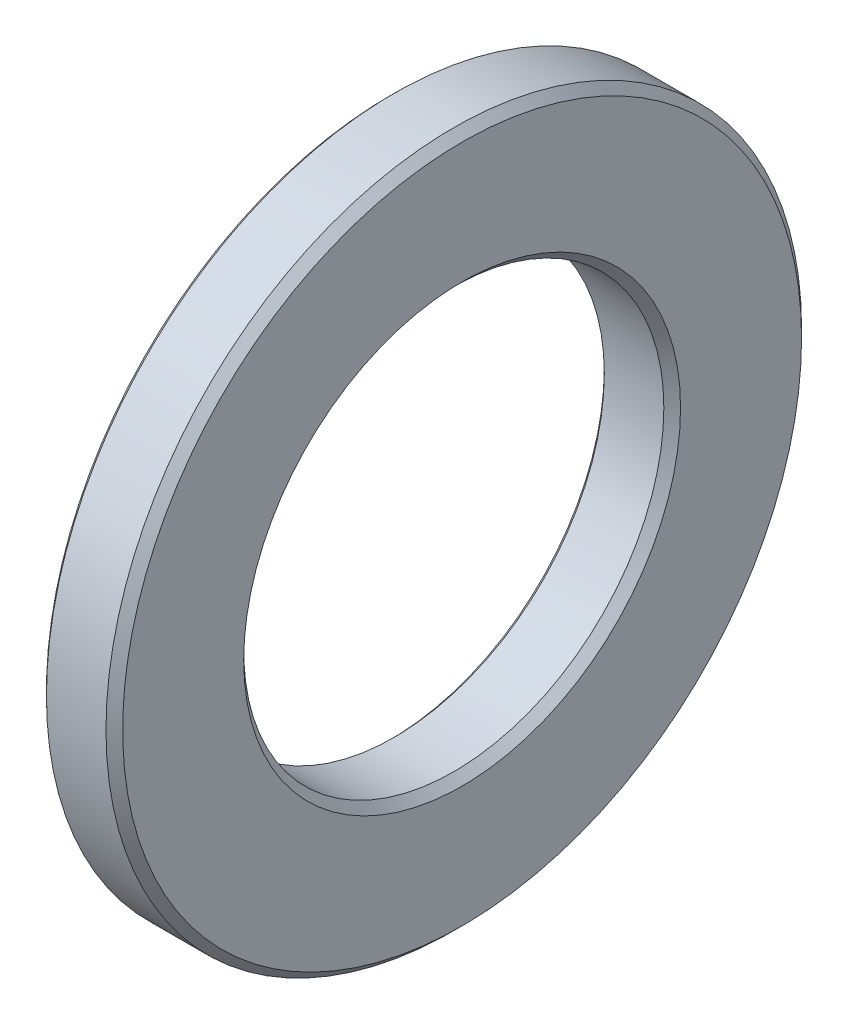
ISO-10303-21;
HEADER;
FILE_DESCRIPTION(('STEP AP214'),'2;1');
FILE_NAME('part.step','',(''),(''),'','','');
FILE_SCHEMA(('AUTOMOTIVE_DESIGN { 1 0 10303 214 1 1 1 1 }'));
ENDSEC;
DATA;
#1=APPLICATION_CONTEXT('core data for automotive mechanical design processes');
#2=APPLICATION_PROTOCOL_DEFINITION('international standard','automotive_design',2000,#1);
#3=PRODUCT_CONTEXT('',#1,'mechanical');
#4=PRODUCT('Part','Part','',(#3));
#5=PRODUCT_RELATED_PRODUCT_CATEGORY('part','',(#4));
#6=PRODUCT_DEFINITION_FORMATION('','',#4);
#7=PRODUCT_DEFINITION_CONTEXT('part definition',#1,'design');
#8=PRODUCT_DEFINITION('design','',#6,#7);
#9=PRODUCT_DEFINITION_SHAPE('','',#8);
#10=(LENGTH_UNIT() NAMED_UNIT(*) SI_UNIT(.MILLI.,.METRE.));
#11=(NAMED_UNIT(*) PLANE_ANGLE_UNIT() SI_UNIT($,.RADIAN.));
#12=(NAMED_UNIT(*) SI_UNIT($,.STERADIAN.) SOLID_ANGLE_UNIT());
#13=UNCERTAINTY_MEASURE_WITH_UNIT(LENGTH_MEASURE(1.E-05),#10,'distance_accuracy_value','');
#14=(GEOMETRIC_REPRESENTATION_CONTEXT(3) GLOBAL_UNCERTAINTY_ASSIGNED_CONTEXT((#13)) GLOBAL_UNIT_ASSIGNED_CONTEXT((#10,
#11,#12)) REPRESENTATION_CONTEXT('',''));
#15=CARTESIAN_POINT('',(0.,0.,0.));
#16=DIRECTION('',(0.,0.,1.));
#17=DIRECTION('',(1.,0.,0.));
#18=AXIS2_PLACEMENT_3D('',#15,#16,#17);
#19=CARTESIAN_POINT('',(14.,0.,20.05025));
#20=DIRECTION('',(1.,0.,0.));
#21=DIRECTION('',(0.,-1.,0.));
#22=AXIS2_PLACEMENT_3D('',#19,#20,#21);
#23=PLANE('',#22);
#24=CARTESIAN_POINT('',(14.,0.,0.));
#25=DIRECTION('',(-1.,0.,0.));
#26=DIRECTION('',(0.,0.,1.));
#27=AXIS2_PLACEMENT_3D('',#24,#25,#26);
#28=CIRCLE('',#27,15.7005);
#29=CARTESIAN_POINT('',(14.,0.,-15.7005));
#30=VERTEX_POINT('',#29);
#31=EDGE_CURVE('E98',#30,#30,#28,.T.);
#32=ORIENTED_EDGE('',*,*,#31,.T.);
#33=EDGE_LOOP('',(#32));
#34=FACE_BOUND('',#33,.T.);
#35=CARTESIAN_POINT('',(14.,0.,0.));
#36=DIRECTION('',(-1.,0.,0.));
#37=DIRECTION('',(0.,0.,1.));
#38=AXIS2_PLACEMENT_3D('',#35,#36,#37);
#39=CIRCLE('',#38,24.4);
#40=CARTESIAN_POINT('',(14.,0.,-24.4));
#41=VERTEX_POINT('',#40);
#42=EDGE_CURVE('E11',#41,#41,#39,.T.);
#43=ORIENTED_EDGE('',*,*,#42,.F.);
#44=EDGE_LOOP('',(#43));
#45=FACE_BOUND('',#44,.T.);
#46=ADVANCED_FACE('F17',(#34,#45),#23,.T.);
#47=CARTESIAN_POINT('',(8.82,0.,16.7788787393238));
#48=DIRECTION('',(-1.,0.,0.));
#49=DIRECTION('',(0.,1.,0.));
#50=AXIS2_PLACEMENT_3D('',#47,#48,#49);
#51=PLANE('',#50);
#52=CARTESIAN_POINT('',(8.82,0.,0.));
#53=DIRECTION('',(-1.,0.,0.));
#54=DIRECTION('',(0.,0.,1.));
#55=AXIS2_PLACEMENT_3D('',#52,#53,#54);
#56=CIRCLE('',#55,15.4005);
#57=CARTESIAN_POINT('',(8.82,0.,-15.4005));
#58=VERTEX_POINT('',#57);
#59=EDGE_CURVE('E85',#58,#58,#56,.T.);
#60=ORIENTED_EDGE('',*,*,#59,.F.);
#61=EDGE_LOOP('',(#60));
#62=FACE_BOUND('',#61,.T.);
#63=CARTESIAN_POINT('',(8.82,0.,0.));
#64=DIRECTION('',(-1.,0.,0.));
#65=DIRECTION('',(0.,0.,1.));
#66=AXIS2_PLACEMENT_3D('',#63,#64,#65);
#67=CIRCLE('',#66,18.1572574786477);
#68=CARTESIAN_POINT('',(8.82,0.,18.1572574786477));
#69=VERTEX_POINT('',#68);
#70=EDGE_CURVE('E81',#69,#69,#67,.T.);
#71=ORIENTED_EDGE('',*,*,#70,.T.);
#72=EDGE_LOOP('',(#71));
#73=FACE_BOUND('',#72,.T.);
#74=ADVANCED_FACE('F19',(#62,#73),#51,.T.);
#75=CARTESIAN_POINT('',(8.82,0.,23.2713712606762));
#76=DIRECTION('',(-1.,0.,0.));
#77=DIRECTION('',(0.,0.,1.));
#78=AXIS2_PLACEMENT_3D('',#75,#76,#77);
#79=PLANE('',#78);
#80=CARTESIAN_POINT('',(8.82,0.,0.));
#81=DIRECTION('',(-1.,0.,0.));
#82=DIRECTION('',(0.,0.,1.));
#83=AXIS2_PLACEMENT_3D('',#80,#81,#82);
#84=CIRCLE('',#83,21.8427425213523);
#85=CARTESIAN_POINT('',(8.82,-21.8427425213523,0.));
#86=VERTEX_POINT('',#85);
#87=EDGE_CURVE('E21',#86,#86,#84,.T.);
#88=ORIENTED_EDGE('',*,*,#87,.F.);
#89=EDGE_LOOP('',(#88));
#90=FACE_BOUND('',#89,.T.);
#91=CARTESIAN_POINT('',(8.82,0.,0.));
#92=DIRECTION('',(-1.,0.,0.));
#93=DIRECTION('',(0.,0.,1.));
#94=AXIS2_PLACEMENT_3D('',#91,#92,#93);
#95=CIRCLE('',#94,24.7);
#96=CARTESIAN_POINT('',(8.82,0.,-24.7));
#97=VERTEX_POINT('',#96);
#98=EDGE_CURVE('E70',#97,#97,#95,.T.);
#99=ORIENTED_EDGE('',*,*,#98,.T.);
#100=EDGE_LOOP('',(#99));
#101=FACE_BOUND('',#100,.T.);
#102=ADVANCED_FACE('F71',(#90,#101),#79,.T.);
#103=CARTESIAN_POINT('',(13.7,0.,0.));
#104=DIRECTION('',(-1.,0.,0.));
#105=DIRECTION('',(0.,0.,1.));
#106=AXIS2_PLACEMENT_3D('',#103,#104,#105);
#107=CONICAL_SURFACE('',#106,24.7,0.78539816339745);
#108=ORIENTED_EDGE('',*,*,#42,.T.);
#109=EDGE_LOOP('',(#108));
#110=FACE_BOUND('',#109,.T.);
#111=CARTESIAN_POINT('',(13.4,0.,0.));
#112=DIRECTION('',(-1.,0.,0.));
#113=DIRECTION('',(0.,0.,1.));
#114=AXIS2_PLACEMENT_3D('',#111,#112,#113);
#115=CIRCLE('',#114,25.);
#116=CARTESIAN_POINT('',(13.4,0.,-25.));
#117=VERTEX_POINT('',#116);
#118=EDGE_CURVE('E28',#117,#117,#115,.T.);
#119=ORIENTED_EDGE('',*,*,#118,.F.);
#120=EDGE_LOOP('',(#119));
#121=FACE_BOUND('',#120,.T.);
#122=ADVANCED_FACE('F138',(#110,#121),#107,.T.);
#123=CARTESIAN_POINT('',(11.26,0.,0.));
#124=DIRECTION('',(-1.,0.,0.));
#125=DIRECTION('',(0.,0.,1.));
#126=AXIS2_PLACEMENT_3D('',#123,#124,#125);
#127=CYLINDRICAL_SURFACE('',#126,25.);
#128=ORIENTED_EDGE('',*,*,#118,.T.);
#129=EDGE_LOOP('',(#128));
#130=FACE_BOUND('',#129,.T.);
#131=CARTESIAN_POINT('',(9.12,0.,0.));
#132=DIRECTION('',(-1.,0.,0.));
#133=DIRECTION('',(0.,0.,1.));
#134=AXIS2_PLACEMENT_3D('',#131,#132,#133);
#135=CIRCLE('',#134,25.);
#136=CARTESIAN_POINT('',(9.12,0.,-25.));
#137=VERTEX_POINT('',#136);
#138=EDGE_CURVE('E74',#137,#137,#135,.T.);
#139=ORIENTED_EDGE('',*,*,#138,.F.);
#140=EDGE_LOOP('',(#139));
#141=FACE_BOUND('',#140,.T.);
#142=ADVANCED_FACE('F136',(#130,#141),#127,.T.);
#143=CARTESIAN_POINT('',(8.97,0.,0.));
#144=DIRECTION('',(1.,0.,0.));
#145=DIRECTION('',(0.,0.,1.));
#146=AXIS2_PLACEMENT_3D('',#143,#144,#145);
#147=CONICAL_SURFACE('',#146,24.85,0.78539816339745);
#148=ORIENTED_EDGE('',*,*,#138,.T.);
#149=EDGE_LOOP('',(#148));
#150=FACE_BOUND('',#149,.T.);
#151=ORIENTED_EDGE('',*,*,#98,.F.);
#152=EDGE_LOOP('',(#151));
#153=FACE_BOUND('',#152,.T.);
#154=ADVANCED_FACE('F123',(#150,#153),#147,.T.);
#155=CARTESIAN_POINT('',(7.,0.,0.));
#156=DIRECTION('',(-1.,0.,0.));
#157=DIRECTION('',(0.,-1.,0.));
#158=AXIS2_PLACEMENT_3D('',#155,#156,#157);
#159=TOROIDAL_SURFACE('',#158,20.,2.59);
#160=ORIENTED_EDGE('',*,*,#87,.T.);
#161=EDGE_LOOP('',(#160));
#162=FACE_BOUND('',#161,.T.);
#163=ORIENTED_EDGE('',*,*,#70,.F.);
#164=EDGE_LOOP('',(#163));
#165=FACE_BOUND('',#164,.T.);
#166=ADVANCED_FACE('F118',(#162,#165),#159,.F.);
#167=CARTESIAN_POINT('',(8.97,0.,0.));
#168=DIRECTION('',(-1.,0.,0.));
#169=DIRECTION('',(0.,0.,1.));
#170=AXIS2_PLACEMENT_3D('',#167,#168,#169);
#171=CONICAL_SURFACE('',#170,15.2505,0.78539816339745);
#172=CARTESIAN_POINT('',(9.12,0.,0.));
#173=DIRECTION('',(-1.,0.,0.));
#174=DIRECTION('',(0.,0.,1.));
#175=AXIS2_PLACEMENT_3D('',#172,#173,#174);
#176=CIRCLE('',#175,15.1005);
#177=CARTESIAN_POINT('',(9.12,0.,-15.1005));
#178=VERTEX_POINT('',#177);
#179=EDGE_CURVE('E91',#178,#178,#176,.T.);
#180=ORIENTED_EDGE('',*,*,#179,.F.);
#181=EDGE_LOOP('',(#180));
#182=FACE_BOUND('',#181,.T.);
#183=ORIENTED_EDGE('',*,*,#59,.T.);
#184=EDGE_LOOP('',(#183));
#185=FACE_BOUND('',#184,.T.);
#186=ADVANCED_FACE('F113',(#182,#185),#171,.F.);
#187=CARTESIAN_POINT('',(11.26,0.,0.));
#188=DIRECTION('',(-1.,0.,0.));
#189=DIRECTION('',(0.,0.,1.));
#190=AXIS2_PLACEMENT_3D('',#187,#188,#189);
#191=CYLINDRICAL_SURFACE('',#190,15.1005);
#192=CARTESIAN_POINT('',(13.4,0.,0.));
#193=DIRECTION('',(-1.,0.,0.));
#194=DIRECTION('',(0.,0.,1.));
#195=AXIS2_PLACEMENT_3D('',#192,#193,#194);
#196=CIRCLE('',#195,15.1005);
#197=CARTESIAN_POINT('',(13.4,0.,-15.1005));
#198=VERTEX_POINT('',#197);
#199=EDGE_CURVE('E102',#198,#198,#196,.T.);
#200=ORIENTED_EDGE('',*,*,#199,.F.);
#201=EDGE_LOOP('',(#200));
#202=FACE_BOUND('',#201,.T.);
#203=ORIENTED_EDGE('',*,*,#179,.T.);
#204=EDGE_LOOP('',(#203));
#205=FACE_BOUND('',#204,.T.);
#206=ADVANCED_FACE('F110',(#202,#205),#191,.F.);
#207=CARTESIAN_POINT('',(13.7,0.,0.));
#208=DIRECTION('',(1.,0.,0.));
#209=DIRECTION('',(0.,0.,1.));
#210=AXIS2_PLACEMENT_3D('',#207,#208,#209);
#211=CONICAL_SURFACE('',#210,15.4005,0.78539816339745);
#212=ORIENTED_EDGE('',*,*,#31,.F.);
#213=EDGE_LOOP('',(#212));
#214=FACE_BOUND('',#213,.T.);
#215=ORIENTED_EDGE('',*,*,#199,.T.);
#216=EDGE_LOOP('',(#215));
#217=FACE_BOUND('',#216,.T.);
#218=ADVANCED_FACE('F108',(#214,#217),#211,.F.);
#219=CLOSED_SHELL('',(#46,#74,#102,#122,#142,#154,#166,#186,#206,#218));
#220=MANIFOLD_SOLID_BREP('B1',#219);
#221=ADVANCED_BREP_SHAPE_REPRESENTATION('',(#18,#220),#14);
#222=SHAPE_DEFINITION_REPRESENTATION(#9,#221);
ENDSEC;
END-ISO-10303-21;
